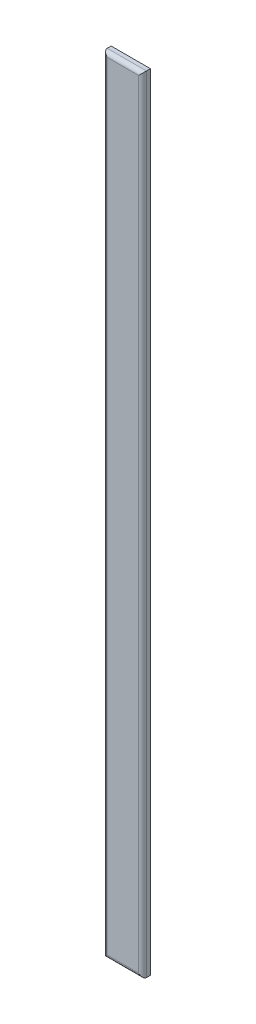
ISO-10303-21;
HEADER;
FILE_DESCRIPTION(('STEP AP214'),'2;1');
FILE_NAME('part.step','',(''),(''),'','','');
FILE_SCHEMA(('AUTOMOTIVE_DESIGN { 1 0 10303 214 1 1 1 1 }'));
ENDSEC;
DATA;
#1=APPLICATION_CONTEXT('core data for automotive mechanical design processes');
#2=APPLICATION_PROTOCOL_DEFINITION('international standard','automotive_design',2000,#1);
#3=PRODUCT_CONTEXT('',#1,'mechanical');
#4=PRODUCT('Part','Part','',(#3));
#5=PRODUCT_RELATED_PRODUCT_CATEGORY('part','',(#4));
#6=PRODUCT_DEFINITION_FORMATION('','',#4);
#7=PRODUCT_DEFINITION_CONTEXT('part definition',#1,'design');
#8=PRODUCT_DEFINITION('design','',#6,#7);
#9=PRODUCT_DEFINITION_SHAPE('','',#8);
#10=(LENGTH_UNIT() NAMED_UNIT(*) SI_UNIT(.MILLI.,.METRE.));
#11=(NAMED_UNIT(*) PLANE_ANGLE_UNIT() SI_UNIT($,.RADIAN.));
#12=(NAMED_UNIT(*) SI_UNIT($,.STERADIAN.) SOLID_ANGLE_UNIT());
#13=UNCERTAINTY_MEASURE_WITH_UNIT(LENGTH_MEASURE(1.E-05),#10,'distance_accuracy_value','');
#14=(GEOMETRIC_REPRESENTATION_CONTEXT(3) GLOBAL_UNCERTAINTY_ASSIGNED_CONTEXT((#13)) GLOBAL_UNIT_ASSIGNED_CONTEXT((#10,
#11,#12)) REPRESENTATION_CONTEXT('',''));
#15=CARTESIAN_POINT('',(0.,0.,0.));
#16=DIRECTION('',(0.,0.,1.));
#17=DIRECTION('',(1.,0.,0.));
#18=AXIS2_PLACEMENT_3D('',#15,#16,#17);
#19=CARTESIAN_POINT('',(0.,100.,1.));
#20=DIRECTION('',(1.,0.,0.));
#21=DIRECTION('',(0.,0.,-1.));
#22=AXIS2_PLACEMENT_3D('',#19,#20,#21);
#23=PLANE('',#22);
#24=DIRECTION('',(0.,0.,-1.));
#25=VECTOR('',#24,1.);
#26=CARTESIAN_POINT('',(0.,0.,1.));
#27=LINE('',#26,#25);
#28=CARTESIAN_POINT('',(0.,0.,0.5));
#29=VERTEX_POINT('',#28);
#30=CARTESIAN_POINT('',(0.,0.,0.));
#31=VERTEX_POINT('',#30);
#32=EDGE_CURVE('E98',#29,#31,#27,.T.);
#33=ORIENTED_EDGE('',*,*,#32,.F.);
#34=DIRECTION('',(0.,-1.,0.));
#35=VECTOR('',#34,1.);
#36=CARTESIAN_POINT('',(0.,100.,0.5));
#37=LINE('',#36,#35);
#38=CARTESIAN_POINT('',(0.,100.,0.5));
#39=VERTEX_POINT('',#38);
#40=EDGE_CURVE('E11',#29,#39,#37,.F.);
#41=ORIENTED_EDGE('',*,*,#40,.T.);
#42=DIRECTION('',(0.,0.,-1.));
#43=VECTOR('',#42,1.);
#44=CARTESIAN_POINT('',(0.,100.,1.));
#45=LINE('',#44,#43);
#46=CARTESIAN_POINT('',(0.,100.,0.));
#47=VERTEX_POINT('',#46);
#48=EDGE_CURVE('E120',#39,#47,#45,.T.);
#49=ORIENTED_EDGE('',*,*,#48,.T.);
#50=DIRECTION('',(0.,-1.,0.));
#51=VECTOR('',#50,1.);
#52=CARTESIAN_POINT('',(0.,100.,0.));
#53=LINE('',#52,#51);
#54=EDGE_CURVE('E114',#47,#31,#53,.T.);
#55=ORIENTED_EDGE('',*,*,#54,.T.);
#56=EDGE_LOOP('',(#33,#41,#49,#55));
#57=FACE_BOUND('',#56,.T.);
#58=ADVANCED_FACE('F45',(#57),#23,.F.);
#59=CARTESIAN_POINT('',(0.,0.,1.));
#60=DIRECTION('',(0.,1.,0.));
#61=DIRECTION('',(0.,0.,1.));
#62=AXIS2_PLACEMENT_3D('',#59,#60,#61);
#63=PLANE('',#62);
#64=DIRECTION('',(0.,0.,-1.));
#65=VECTOR('',#64,1.);
#66=CARTESIAN_POINT('',(5.,0.,1.));
#67=LINE('',#66,#65);
#68=CARTESIAN_POINT('',(5.,0.,0.5));
#69=VERTEX_POINT('',#68);
#70=CARTESIAN_POINT('',(5.,0.,0.));
#71=VERTEX_POINT('',#70);
#72=EDGE_CURVE('E108',#69,#71,#67,.T.);
#73=ORIENTED_EDGE('',*,*,#72,.F.);
#74=DIRECTION('',(1.,0.,0.));
#75=VECTOR('',#74,1.);
#76=CARTESIAN_POINT('',(0.,0.,0.5));
#77=LINE('',#76,#75);
#78=EDGE_CURVE('E55',#69,#29,#77,.F.);
#79=ORIENTED_EDGE('',*,*,#78,.T.);
#80=ORIENTED_EDGE('',*,*,#32,.T.);
#81=DIRECTION('',(1.,0.,0.));
#82=VECTOR('',#81,1.);
#83=CARTESIAN_POINT('',(0.,0.,0.));
#84=LINE('',#83,#82);
#85=EDGE_CURVE('E101',#31,#71,#84,.T.);
#86=ORIENTED_EDGE('',*,*,#85,.T.);
#87=EDGE_LOOP('',(#73,#79,#80,#86));
#88=FACE_BOUND('',#87,.T.);
#89=ADVANCED_FACE('F100',(#88),#63,.F.);
#90=CARTESIAN_POINT('',(5.,0.,1.));
#91=DIRECTION('',(-1.,0.,0.));
#92=DIRECTION('',(0.,0.,1.));
#93=AXIS2_PLACEMENT_3D('',#90,#91,#92);
#94=PLANE('',#93);
#95=DIRECTION('',(0.,0.,-1.));
#96=VECTOR('',#95,1.);
#97=CARTESIAN_POINT('',(5.,100.,1.));
#98=LINE('',#97,#96);
#99=CARTESIAN_POINT('',(5.,100.,0.5));
#100=VERTEX_POINT('',#99);
#101=CARTESIAN_POINT('',(5.,100.,0.));
#102=VERTEX_POINT('',#101);
#103=EDGE_CURVE('E135',#100,#102,#98,.T.);
#104=ORIENTED_EDGE('',*,*,#103,.F.);
#105=DIRECTION('',(0.,1.,0.));
#106=VECTOR('',#105,1.);
#107=CARTESIAN_POINT('',(5.,0.,0.5));
#108=LINE('',#107,#106);
#109=EDGE_CURVE('E70',#100,#69,#108,.F.);
#110=ORIENTED_EDGE('',*,*,#109,.T.);
#111=ORIENTED_EDGE('',*,*,#72,.T.);
#112=DIRECTION('',(0.,1.,0.));
#113=VECTOR('',#112,1.);
#114=CARTESIAN_POINT('',(5.,0.,0.));
#115=LINE('',#114,#113);
#116=EDGE_CURVE('E116',#71,#102,#115,.T.);
#117=ORIENTED_EDGE('',*,*,#116,.T.);
#118=EDGE_LOOP('',(#104,#110,#111,#117));
#119=FACE_BOUND('',#118,.T.);
#120=ADVANCED_FACE('F185',(#119),#94,.F.);
#121=CARTESIAN_POINT('',(5.,100.,1.));
#122=DIRECTION('',(0.,-1.,0.));
#123=DIRECTION('',(0.,0.,-1.));
#124=AXIS2_PLACEMENT_3D('',#121,#122,#123);
#125=PLANE('',#124);
#126=ORIENTED_EDGE('',*,*,#48,.F.);
#127=DIRECTION('',(-1.,0.,0.));
#128=VECTOR('',#127,1.);
#129=CARTESIAN_POINT('',(5.,100.,0.5));
#130=LINE('',#129,#128);
#131=EDGE_CURVE('E152',#39,#100,#130,.F.);
#132=ORIENTED_EDGE('',*,*,#131,.T.);
#133=ORIENTED_EDGE('',*,*,#103,.T.);
#134=DIRECTION('',(-1.,0.,0.));
#135=VECTOR('',#134,1.);
#136=CARTESIAN_POINT('',(5.,100.,0.));
#137=LINE('',#136,#135);
#138=EDGE_CURVE('E130',#102,#47,#137,.T.);
#139=ORIENTED_EDGE('',*,*,#138,.T.);
#140=EDGE_LOOP('',(#126,#132,#133,#139));
#141=FACE_BOUND('',#140,.T.);
#142=ADVANCED_FACE('F184',(#141),#125,.F.);
#143=CARTESIAN_POINT('',(0.,0.,1.));
#144=DIRECTION('',(0.,0.,1.));
#145=DIRECTION('',(1.,0.,0.));
#146=AXIS2_PLACEMENT_3D('',#143,#144,#145);
#147=PLANE('',#146);
#148=DIRECTION('',(0.,1.,0.));
#149=VECTOR('',#148,1.);
#150=CARTESIAN_POINT('',(4.5,100.,1.));
#151=LINE('',#150,#149);
#152=CARTESIAN_POINT('',(4.5,0.5,1.));
#153=VERTEX_POINT('',#152);
#154=CARTESIAN_POINT('',(4.5,99.5,1.));
#155=VERTEX_POINT('',#154);
#156=EDGE_CURVE('E145',#153,#155,#151,.T.);
#157=ORIENTED_EDGE('',*,*,#156,.T.);
#158=DIRECTION('',(-1.,0.,0.));
#159=VECTOR('',#158,1.);
#160=CARTESIAN_POINT('',(0.,99.5,1.));
#161=LINE('',#160,#159);
#162=CARTESIAN_POINT('',(0.5,99.5,1.));
#163=VERTEX_POINT('',#162);
#164=EDGE_CURVE('E148',#155,#163,#161,.T.);
#165=ORIENTED_EDGE('',*,*,#164,.T.);
#166=DIRECTION('',(0.,-1.,0.));
#167=VECTOR('',#166,1.);
#168=CARTESIAN_POINT('',(0.5,0.,1.));
#169=LINE('',#168,#167);
#170=CARTESIAN_POINT('',(0.5,0.5,1.));
#171=VERTEX_POINT('',#170);
#172=EDGE_CURVE('E107',#163,#171,#169,.T.);
#173=ORIENTED_EDGE('',*,*,#172,.T.);
#174=DIRECTION('',(1.,0.,0.));
#175=VECTOR('',#174,1.);
#176=CARTESIAN_POINT('',(5.,0.5,1.));
#177=LINE('',#176,#175);
#178=EDGE_CURVE('E142',#171,#153,#177,.T.);
#179=ORIENTED_EDGE('',*,*,#178,.T.);
#180=EDGE_LOOP('',(#157,#165,#173,#179));
#181=FACE_BOUND('',#180,.T.);
#182=ADVANCED_FACE('F177',(#181),#147,.T.);
#183=CARTESIAN_POINT('',(0.,0.,0.));
#184=DIRECTION('',(0.,0.,1.));
#185=DIRECTION('',(1.,0.,0.));
#186=AXIS2_PLACEMENT_3D('',#183,#184,#185);
#187=PLANE('',#186);
#188=ORIENTED_EDGE('',*,*,#54,.F.);
#189=ORIENTED_EDGE('',*,*,#138,.F.);
#190=ORIENTED_EDGE('',*,*,#116,.F.);
#191=ORIENTED_EDGE('',*,*,#85,.F.);
#192=EDGE_LOOP('',(#188,#189,#190,#191));
#193=FACE_BOUND('',#192,.T.);
#194=ADVANCED_FACE('F112',(#193),#187,.F.);
#195=CARTESIAN_POINT('',(0.,0.5,0.5));
#196=DIRECTION('',(-1.,0.,0.));
#197=DIRECTION('',(0.,0.,1.));
#198=AXIS2_PLACEMENT_3D('',#195,#196,#197);
#199=CYLINDRICAL_SURFACE('',#198,0.5);
#200=CARTESIAN_POINT('',(0.5,0.5,0.5));
#201=DIRECTION('',(-0.707106781186547,0.707106781186547,0.));
#202=DIRECTION('',(0.707106781186547,0.707106781186547,0.));
#203=AXIS2_PLACEMENT_3D('',#200,#201,#202);
#204=ELLIPSE('',#203,0.707106781186547,0.5);
#205=EDGE_CURVE('E126',#29,#171,#204,.T.);
#206=ORIENTED_EDGE('',*,*,#205,.F.);
#207=ORIENTED_EDGE('',*,*,#78,.F.);
#208=CARTESIAN_POINT('',(4.5,0.5,0.5));
#209=DIRECTION('',(-0.707106781186547,-0.707106781186547,0.));
#210=DIRECTION('',(-0.707106781186547,0.707106781186547,0.));
#211=AXIS2_PLACEMENT_3D('',#208,#209,#210);
#212=ELLIPSE('',#211,0.707106781186547,0.5);
#213=EDGE_CURVE('E49',#153,#69,#212,.F.);
#214=ORIENTED_EDGE('',*,*,#213,.F.);
#215=ORIENTED_EDGE('',*,*,#178,.F.);
#216=EDGE_LOOP('',(#206,#207,#214,#215));
#217=FACE_BOUND('',#216,.T.);
#218=ADVANCED_FACE('F47',(#217),#199,.T.);
#219=CARTESIAN_POINT('',(4.5,0.,0.5));
#220=DIRECTION('',(0.,-1.,0.));
#221=DIRECTION('',(0.,0.,-1.));
#222=AXIS2_PLACEMENT_3D('',#219,#220,#221);
#223=CYLINDRICAL_SURFACE('',#222,0.5);
#224=ORIENTED_EDGE('',*,*,#213,.T.);
#225=ORIENTED_EDGE('',*,*,#109,.F.);
#226=CARTESIAN_POINT('',(4.5,99.5,0.5));
#227=DIRECTION('',(0.707106781186547,-0.707106781186547,0.));
#228=DIRECTION('',(-0.707106781186547,-0.707106781186547,0.));
#229=AXIS2_PLACEMENT_3D('',#226,#227,#228);
#230=ELLIPSE('',#229,0.707106781186547,0.5);
#231=EDGE_CURVE('E163',#155,#100,#230,.F.);
#232=ORIENTED_EDGE('',*,*,#231,.F.);
#233=ORIENTED_EDGE('',*,*,#156,.F.);
#234=EDGE_LOOP('',(#224,#225,#232,#233));
#235=FACE_BOUND('',#234,.T.);
#236=ADVANCED_FACE('F203',(#235),#223,.T.);
#237=CARTESIAN_POINT('',(0.5,0.,0.5));
#238=DIRECTION('',(0.,1.,0.));
#239=DIRECTION('',(0.,0.,1.));
#240=AXIS2_PLACEMENT_3D('',#237,#238,#239);
#241=CYLINDRICAL_SURFACE('',#240,0.5);
#242=ORIENTED_EDGE('',*,*,#205,.T.);
#243=ORIENTED_EDGE('',*,*,#172,.F.);
#244=CARTESIAN_POINT('',(0.5,99.5,0.5));
#245=DIRECTION('',(0.707106781186547,0.707106781186547,0.));
#246=DIRECTION('',(-0.707106781186547,0.707106781186547,0.));
#247=AXIS2_PLACEMENT_3D('',#244,#245,#246);
#248=ELLIPSE('',#247,0.707106781186547,0.5);
#249=EDGE_CURVE('E160',#39,#163,#248,.T.);
#250=ORIENTED_EDGE('',*,*,#249,.F.);
#251=ORIENTED_EDGE('',*,*,#40,.F.);
#252=EDGE_LOOP('',(#242,#243,#250,#251));
#253=FACE_BOUND('',#252,.T.);
#254=ADVANCED_FACE('F170',(#253),#241,.T.);
#255=CARTESIAN_POINT('',(0.,99.5,0.5));
#256=DIRECTION('',(1.,0.,0.));
#257=DIRECTION('',(0.,0.,-1.));
#258=AXIS2_PLACEMENT_3D('',#255,#256,#257);
#259=CYLINDRICAL_SURFACE('',#258,0.5);
#260=ORIENTED_EDGE('',*,*,#231,.T.);
#261=ORIENTED_EDGE('',*,*,#131,.F.);
#262=ORIENTED_EDGE('',*,*,#249,.T.);
#263=ORIENTED_EDGE('',*,*,#164,.F.);
#264=EDGE_LOOP('',(#260,#261,#262,#263));
#265=FACE_BOUND('',#264,.T.);
#266=ADVANCED_FACE('F181',(#265),#259,.T.);
#267=CLOSED_SHELL('',(#58,#89,#120,#142,#182,#194,#218,#236,#254,#266));
#268=MANIFOLD_SOLID_BREP('B2',#267);
#269=ADVANCED_BREP_SHAPE_REPRESENTATION('',(#18,#268),#14);
#270=SHAPE_DEFINITION_REPRESENTATION(#9,#269);
ENDSEC;
END-ISO-10303-21;
